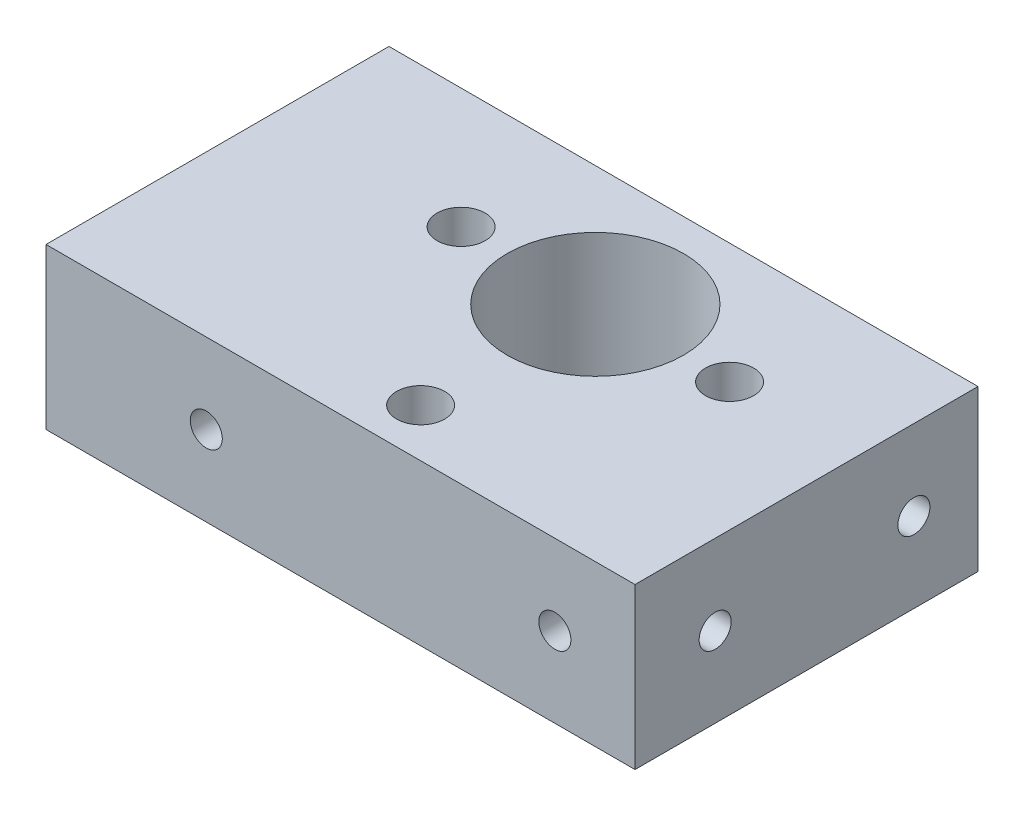
ISO-10303-21;
HEADER;
FILE_DESCRIPTION(('STEP AP214'),'2;1');
FILE_NAME('part.step','',(''),(''),'','','');
FILE_SCHEMA(('AUTOMOTIVE_DESIGN { 1 0 10303 214 1 1 1 1 }'));
ENDSEC;
DATA;
#1=APPLICATION_CONTEXT('core data for automotive mechanical design processes');
#2=APPLICATION_PROTOCOL_DEFINITION('international standard','automotive_design',2000,#1);
#3=PRODUCT_CONTEXT('',#1,'mechanical');
#4=PRODUCT('Part','Part','',(#3));
#5=PRODUCT_RELATED_PRODUCT_CATEGORY('part','',(#4));
#6=PRODUCT_DEFINITION_FORMATION('','',#4);
#7=PRODUCT_DEFINITION_CONTEXT('part definition',#1,'design');
#8=PRODUCT_DEFINITION('design','',#6,#7);
#9=PRODUCT_DEFINITION_SHAPE('','',#8);
#10=(LENGTH_UNIT() NAMED_UNIT(*) SI_UNIT(.MILLI.,.METRE.));
#11=(NAMED_UNIT(*) PLANE_ANGLE_UNIT() SI_UNIT($,.RADIAN.));
#12=(NAMED_UNIT(*) SI_UNIT($,.STERADIAN.) SOLID_ANGLE_UNIT());
#13=UNCERTAINTY_MEASURE_WITH_UNIT(LENGTH_MEASURE(1.E-05),#10,'distance_accuracy_value','');
#14=(GEOMETRIC_REPRESENTATION_CONTEXT(3) GLOBAL_UNCERTAINTY_ASSIGNED_CONTEXT((#13)) GLOBAL_UNIT_ASSIGNED_CONTEXT((#10,
#11,#12)) REPRESENTATION_CONTEXT('',''));
#15=CARTESIAN_POINT('',(0.,0.,0.));
#16=DIRECTION('',(0.,0.,1.));
#17=DIRECTION('',(1.,0.,0.));
#18=AXIS2_PLACEMENT_3D('',#15,#16,#17);
#19=CARTESIAN_POINT('',(0.,10.,13.9));
#20=DIRECTION('',(0.,0.,-1.));
#21=DIRECTION('',(-1.,0.,0.));
#22=AXIS2_PLACEMENT_3D('',#19,#20,#21);
#23=PLANE('',#22);
#24=CARTESIAN_POINT('',(11.375,5.,13.9));
#25=DIRECTION('',(0.,0.,-1.));
#26=DIRECTION('',(-1.,0.,0.));
#27=AXIS2_PLACEMENT_3D('',#24,#25,#26);
#28=CIRCLE('',#27,1.);
#29=CARTESIAN_POINT('',(10.375,5.,13.9));
#30=VERTEX_POINT('',#29);
#31=EDGE_CURVE('E176',#30,#30,#28,.T.);
#32=ORIENTED_EDGE('',*,*,#31,.T.);
#33=EDGE_LOOP('',(#32));
#34=FACE_BOUND('',#33,.T.);
#35=CARTESIAN_POINT('',(-10.375,5.,13.9));
#36=DIRECTION('',(0.,0.,-1.));
#37=DIRECTION('',(-1.,0.,0.));
#38=AXIS2_PLACEMENT_3D('',#35,#36,#37);
#39=CIRCLE('',#38,1.);
#40=CARTESIAN_POINT('',(-11.375,5.,13.9));
#41=VERTEX_POINT('',#40);
#42=EDGE_CURVE('E180',#41,#41,#39,.T.);
#43=ORIENTED_EDGE('',*,*,#42,.T.);
#44=EDGE_LOOP('',(#43));
#45=FACE_BOUND('',#44,.T.);
#46=DIRECTION('',(1.,0.,0.));
#47=VECTOR('',#46,1.);
#48=CARTESIAN_POINT('',(0.,0.,13.9));
#49=LINE('',#48,#47);
#50=CARTESIAN_POINT('',(-20.375,0.,13.9));
#51=VERTEX_POINT('',#50);
#52=CARTESIAN_POINT('',(16.375,0.,13.9));
#53=VERTEX_POINT('',#52);
#54=EDGE_CURVE('E117',#51,#53,#49,.T.);
#55=ORIENTED_EDGE('',*,*,#54,.T.);
#56=DIRECTION('',(0.,-1.,0.));
#57=VECTOR('',#56,1.);
#58=CARTESIAN_POINT('',(16.375,10.,13.9));
#59=LINE('',#58,#57);
#60=CARTESIAN_POINT('',(16.375,10.,13.9));
#61=VERTEX_POINT('',#60);
#62=EDGE_CURVE('E12',#61,#53,#59,.T.);
#63=ORIENTED_EDGE('',*,*,#62,.F.);
#64=DIRECTION('',(1.,0.,0.));
#65=VECTOR('',#64,1.);
#66=CARTESIAN_POINT('',(0.,10.,13.9));
#67=LINE('',#66,#65);
#68=CARTESIAN_POINT('',(-20.375,10.,13.9));
#69=VERTEX_POINT('',#68);
#70=EDGE_CURVE('E89',#69,#61,#67,.T.);
#71=ORIENTED_EDGE('',*,*,#70,.F.);
#72=DIRECTION('',(0.,-1.,0.));
#73=VECTOR('',#72,1.);
#74=CARTESIAN_POINT('',(-20.375,10.,13.9));
#75=LINE('',#74,#73);
#76=EDGE_CURVE('E116',#69,#51,#75,.T.);
#77=ORIENTED_EDGE('',*,*,#76,.T.);
#78=EDGE_LOOP('',(#55,#63,#71,#77));
#79=FACE_BOUND('',#78,.T.);
#80=ADVANCED_FACE('F39',(#34,#45,#79),#23,.F.);
#81=CARTESIAN_POINT('',(16.375,10.,0.));
#82=DIRECTION('',(-1.,0.,0.));
#83=DIRECTION('',(0.,0.,1.));
#84=AXIS2_PLACEMENT_3D('',#81,#82,#83);
#85=PLANE('',#84);
#86=CARTESIAN_POINT('',(16.375,5.,8.9));
#87=DIRECTION('',(1.,0.,0.));
#88=DIRECTION('',(0.,0.,-1.));
#89=AXIS2_PLACEMENT_3D('',#86,#87,#88);
#90=CIRCLE('',#89,1.);
#91=CARTESIAN_POINT('',(16.375,5.,7.9));
#92=VERTEX_POINT('',#91);
#93=EDGE_CURVE('E315',#92,#92,#90,.T.);
#94=ORIENTED_EDGE('',*,*,#93,.F.);
#95=EDGE_LOOP('',(#94));
#96=FACE_BOUND('',#95,.T.);
#97=CARTESIAN_POINT('',(16.375,5.,-3.5));
#98=DIRECTION('',(1.,0.,0.));
#99=DIRECTION('',(0.,0.,-1.));
#100=AXIS2_PLACEMENT_3D('',#97,#98,#99);
#101=CIRCLE('',#100,1.);
#102=CARTESIAN_POINT('',(16.375,5.,-4.5));
#103=VERTEX_POINT('',#102);
#104=EDGE_CURVE('E320',#103,#103,#101,.T.);
#105=ORIENTED_EDGE('',*,*,#104,.F.);
#106=EDGE_LOOP('',(#105));
#107=FACE_BOUND('',#106,.T.);
#108=DIRECTION('',(0.,0.,-1.));
#109=VECTOR('',#108,1.);
#110=CARTESIAN_POINT('',(16.375,0.,0.));
#111=LINE('',#110,#109);
#112=CARTESIAN_POINT('',(16.375,0.,-7.5));
#113=VERTEX_POINT('',#112);
#114=EDGE_CURVE('E94',#53,#113,#111,.T.);
#115=ORIENTED_EDGE('',*,*,#114,.T.);
#116=DIRECTION('',(0.,-1.,0.));
#117=VECTOR('',#116,1.);
#118=CARTESIAN_POINT('',(16.375,10.,-7.5));
#119=LINE('',#118,#117);
#120=CARTESIAN_POINT('',(16.375,10.,-7.5));
#121=VERTEX_POINT('',#120);
#122=EDGE_CURVE('E48',#121,#113,#119,.T.);
#123=ORIENTED_EDGE('',*,*,#122,.F.);
#124=DIRECTION('',(0.,0.,-1.));
#125=VECTOR('',#124,1.);
#126=CARTESIAN_POINT('',(16.375,10.,0.));
#127=LINE('',#126,#125);
#128=EDGE_CURVE('E83',#61,#121,#127,.T.);
#129=ORIENTED_EDGE('',*,*,#128,.F.);
#130=ORIENTED_EDGE('',*,*,#62,.T.);
#131=EDGE_LOOP('',(#115,#123,#129,#130));
#132=FACE_BOUND('',#131,.T.);
#133=ADVANCED_FACE('F93',(#96,#107,#132),#85,.F.);
#134=CARTESIAN_POINT('',(0.,10.,-7.5));
#135=DIRECTION('',(0.,0.,-1.));
#136=DIRECTION('',(-1.,0.,0.));
#137=AXIS2_PLACEMENT_3D('',#134,#135,#136);
#138=PLANE('',#137);
#139=CARTESIAN_POINT('',(11.375,5.,-7.5));
#140=DIRECTION('',(0.,0.,-1.));
#141=DIRECTION('',(-1.,0.,0.));
#142=AXIS2_PLACEMENT_3D('',#139,#140,#141);
#143=CIRCLE('',#142,1.);
#144=CARTESIAN_POINT('',(10.375,5.,-7.5));
#145=VERTEX_POINT('',#144);
#146=EDGE_CURVE('E205',#145,#145,#143,.T.);
#147=ORIENTED_EDGE('',*,*,#146,.F.);
#148=EDGE_LOOP('',(#147));
#149=FACE_BOUND('',#148,.T.);
#150=CARTESIAN_POINT('',(-10.375,5.,-7.5));
#151=DIRECTION('',(0.,0.,-1.));
#152=DIRECTION('',(-1.,0.,0.));
#153=AXIS2_PLACEMENT_3D('',#150,#151,#152);
#154=CIRCLE('',#153,1.);
#155=CARTESIAN_POINT('',(-11.375,5.,-7.5));
#156=VERTEX_POINT('',#155);
#157=EDGE_CURVE('E208',#156,#156,#154,.T.);
#158=ORIENTED_EDGE('',*,*,#157,.F.);
#159=EDGE_LOOP('',(#158));
#160=FACE_BOUND('',#159,.T.);
#161=DIRECTION('',(1.,0.,0.));
#162=VECTOR('',#161,1.);
#163=CARTESIAN_POINT('',(0.,0.,-7.5));
#164=LINE('',#163,#162);
#165=CARTESIAN_POINT('',(-20.375,0.,-7.5));
#166=VERTEX_POINT('',#165);
#167=EDGE_CURVE('E121',#166,#113,#164,.T.);
#168=ORIENTED_EDGE('',*,*,#167,.F.);
#169=DIRECTION('',(0.,-1.,0.));
#170=VECTOR('',#169,1.);
#171=CARTESIAN_POINT('',(-20.375,10.,-7.5));
#172=LINE('',#171,#170);
#173=CARTESIAN_POINT('',(-20.375,10.,-7.5));
#174=VERTEX_POINT('',#173);
#175=EDGE_CURVE('E73',#174,#166,#172,.T.);
#176=ORIENTED_EDGE('',*,*,#175,.F.);
#177=DIRECTION('',(1.,0.,0.));
#178=VECTOR('',#177,1.);
#179=CARTESIAN_POINT('',(0.,10.,-7.5));
#180=LINE('',#179,#178);
#181=EDGE_CURVE('E87',#174,#121,#180,.T.);
#182=ORIENTED_EDGE('',*,*,#181,.T.);
#183=ORIENTED_EDGE('',*,*,#122,.T.);
#184=EDGE_LOOP('',(#168,#176,#182,#183));
#185=FACE_BOUND('',#184,.T.);
#186=ADVANCED_FACE('F99',(#149,#160,#185),#138,.T.);
#187=CARTESIAN_POINT('',(8.375,10.,0.));
#188=DIRECTION('',(0.,-1.,0.));
#189=DIRECTION('',(0.,0.,-1.));
#190=AXIS2_PLACEMENT_3D('',#187,#188,#189);
#191=CYLINDRICAL_SURFACE('',#190,1.5);
#192=CARTESIAN_POINT('',(8.375,7.,0.));
#193=DIRECTION('',(0.,1.,0.));
#194=DIRECTION('',(0.,0.,1.));
#195=AXIS2_PLACEMENT_3D('',#192,#193,#194);
#196=CIRCLE('',#195,1.5);
#197=CARTESIAN_POINT('',(8.375,7.,1.5));
#198=VERTEX_POINT('',#197);
#199=EDGE_CURVE('E42',#198,#198,#196,.T.);
#200=ORIENTED_EDGE('',*,*,#199,.F.);
#201=EDGE_LOOP('',(#200));
#202=FACE_BOUND('',#201,.T.);
#203=CARTESIAN_POINT('',(8.375,10.,0.));
#204=DIRECTION('',(0.,1.,0.));
#205=DIRECTION('',(0.,0.,1.));
#206=AXIS2_PLACEMENT_3D('',#203,#204,#205);
#207=CIRCLE('',#206,1.5);
#208=CARTESIAN_POINT('',(8.375,10.,1.5));
#209=VERTEX_POINT('',#208);
#210=EDGE_CURVE('E110',#209,#209,#207,.T.);
#211=ORIENTED_EDGE('',*,*,#210,.T.);
#212=EDGE_LOOP('',(#211));
#213=FACE_BOUND('',#212,.T.);
#214=ADVANCED_FACE('F142',(#202,#213),#191,.F.);
#215=CARTESIAN_POINT('',(-8.375,10.,0.));
#216=DIRECTION('',(0.,-1.,0.));
#217=DIRECTION('',(0.,0.,-1.));
#218=AXIS2_PLACEMENT_3D('',#215,#216,#217);
#219=CYLINDRICAL_SURFACE('',#218,1.5);
#220=CARTESIAN_POINT('',(-8.375,7.,0.));
#221=DIRECTION('',(0.,1.,0.));
#222=DIRECTION('',(0.,0.,1.));
#223=AXIS2_PLACEMENT_3D('',#220,#221,#222);
#224=CIRCLE('',#223,1.5);
#225=CARTESIAN_POINT('',(-8.375,7.,1.5));
#226=VERTEX_POINT('',#225);
#227=EDGE_CURVE('E131',#226,#226,#224,.T.);
#228=ORIENTED_EDGE('',*,*,#227,.F.);
#229=EDGE_LOOP('',(#228));
#230=FACE_BOUND('',#229,.T.);
#231=CARTESIAN_POINT('',(-8.375,10.,0.));
#232=DIRECTION('',(0.,1.,0.));
#233=DIRECTION('',(0.,0.,1.));
#234=AXIS2_PLACEMENT_3D('',#231,#232,#233);
#235=CIRCLE('',#234,1.5);
#236=CARTESIAN_POINT('',(-8.375,10.,1.5));
#237=VERTEX_POINT('',#236);
#238=EDGE_CURVE('E107',#237,#237,#235,.T.);
#239=ORIENTED_EDGE('',*,*,#238,.T.);
#240=EDGE_LOOP('',(#239));
#241=FACE_BOUND('',#240,.T.);
#242=ADVANCED_FACE('F145',(#230,#241),#219,.F.);
#243=CARTESIAN_POINT('',(0.,10.,0.));
#244=DIRECTION('',(0.,-1.,0.));
#245=DIRECTION('',(0.,0.,-1.));
#246=AXIS2_PLACEMENT_3D('',#243,#244,#245);
#247=CYLINDRICAL_SURFACE('',#246,5.5);
#248=CARTESIAN_POINT('',(0.,10.,0.));
#249=DIRECTION('',(0.,1.,0.));
#250=DIRECTION('',(0.,0.,1.));
#251=AXIS2_PLACEMENT_3D('',#248,#249,#250);
#252=CIRCLE('',#251,5.5);
#253=CARTESIAN_POINT('',(0.,10.,5.5));
#254=VERTEX_POINT('',#253);
#255=EDGE_CURVE('E101',#254,#254,#252,.T.);
#256=ORIENTED_EDGE('',*,*,#255,.T.);
#257=EDGE_LOOP('',(#256));
#258=FACE_BOUND('',#257,.T.);
#259=CARTESIAN_POINT('',(0.,0.,0.));
#260=DIRECTION('',(0.,1.,0.));
#261=DIRECTION('',(0.,0.,1.));
#262=AXIS2_PLACEMENT_3D('',#259,#260,#261);
#263=CIRCLE('',#262,5.5);
#264=CARTESIAN_POINT('',(0.,0.,5.5));
#265=VERTEX_POINT('',#264);
#266=EDGE_CURVE('E124',#265,#265,#263,.T.);
#267=ORIENTED_EDGE('',*,*,#266,.F.);
#268=EDGE_LOOP('',(#267));
#269=FACE_BOUND('',#268,.T.);
#270=ADVANCED_FACE('F163',(#258,#269),#247,.F.);
#271=CARTESIAN_POINT('',(-20.375,10.,0.));
#272=DIRECTION('',(1.,0.,0.));
#273=DIRECTION('',(0.,0.,-1.));
#274=AXIS2_PLACEMENT_3D('',#271,#272,#273);
#275=PLANE('',#274);
#276=DIRECTION('',(0.,0.,1.));
#277=VECTOR('',#276,1.);
#278=CARTESIAN_POINT('',(-20.375,0.,0.));
#279=LINE('',#278,#277);
#280=EDGE_CURVE('E76',#166,#51,#279,.T.);
#281=ORIENTED_EDGE('',*,*,#280,.T.);
#282=ORIENTED_EDGE('',*,*,#76,.F.);
#283=DIRECTION('',(0.,0.,1.));
#284=VECTOR('',#283,1.);
#285=CARTESIAN_POINT('',(-20.375,10.,0.));
#286=LINE('',#285,#284);
#287=EDGE_CURVE('E57',#174,#69,#286,.T.);
#288=ORIENTED_EDGE('',*,*,#287,.F.);
#289=ORIENTED_EDGE('',*,*,#175,.T.);
#290=EDGE_LOOP('',(#281,#282,#288,#289));
#291=FACE_BOUND('',#290,.T.);
#292=ADVANCED_FACE('F157',(#291),#275,.F.);
#293=CARTESIAN_POINT('',(0.,10.,10.9));
#294=DIRECTION('',(0.,-1.,0.));
#295=DIRECTION('',(0.,0.,-1.));
#296=AXIS2_PLACEMENT_3D('',#293,#294,#295);
#297=CYLINDRICAL_SURFACE('',#296,1.5);
#298=CARTESIAN_POINT('',(0.,7.,10.9));
#299=DIRECTION('',(0.,1.,0.));
#300=DIRECTION('',(0.,0.,1.));
#301=AXIS2_PLACEMENT_3D('',#298,#299,#300);
#302=CIRCLE('',#301,1.5);
#303=CARTESIAN_POINT('',(0.,7.,12.4));
#304=VERTEX_POINT('',#303);
#305=EDGE_CURVE('E129',#304,#304,#302,.T.);
#306=ORIENTED_EDGE('',*,*,#305,.F.);
#307=EDGE_LOOP('',(#306));
#308=FACE_BOUND('',#307,.T.);
#309=CARTESIAN_POINT('',(0.,10.,10.9));
#310=DIRECTION('',(0.,1.,0.));
#311=DIRECTION('',(0.,0.,1.));
#312=AXIS2_PLACEMENT_3D('',#309,#310,#311);
#313=CIRCLE('',#312,1.5);
#314=CARTESIAN_POINT('',(0.,10.,12.4));
#315=VERTEX_POINT('',#314);
#316=EDGE_CURVE('E113',#315,#315,#313,.T.);
#317=ORIENTED_EDGE('',*,*,#316,.T.);
#318=EDGE_LOOP('',(#317));
#319=FACE_BOUND('',#318,.T.);
#320=ADVANCED_FACE('F152',(#308,#319),#297,.F.);
#321=CARTESIAN_POINT('',(0.,10.,0.));
#322=DIRECTION('',(0.,1.,0.));
#323=DIRECTION('',(0.,0.,1.));
#324=AXIS2_PLACEMENT_3D('',#321,#322,#323);
#325=PLANE('',#324);
#326=ORIENTED_EDGE('',*,*,#70,.T.);
#327=ORIENTED_EDGE('',*,*,#128,.T.);
#328=ORIENTED_EDGE('',*,*,#181,.F.);
#329=ORIENTED_EDGE('',*,*,#287,.T.);
#330=EDGE_LOOP('',(#326,#327,#328,#329));
#331=FACE_BOUND('',#330,.T.);
#332=ORIENTED_EDGE('',*,*,#255,.F.);
#333=EDGE_LOOP('',(#332));
#334=FACE_BOUND('',#333,.T.);
#335=ORIENTED_EDGE('',*,*,#238,.F.);
#336=EDGE_LOOP('',(#335));
#337=FACE_BOUND('',#336,.T.);
#338=ORIENTED_EDGE('',*,*,#210,.F.);
#339=EDGE_LOOP('',(#338));
#340=FACE_BOUND('',#339,.T.);
#341=ORIENTED_EDGE('',*,*,#316,.F.);
#342=EDGE_LOOP('',(#341));
#343=FACE_BOUND('',#342,.T.);
#344=ADVANCED_FACE('F84',(#331,#334,#337,#340,#343),#325,.T.);
#345=CARTESIAN_POINT('',(0.,0.,0.));
#346=DIRECTION('',(0.,1.,0.));
#347=DIRECTION('',(0.,0.,1.));
#348=AXIS2_PLACEMENT_3D('',#345,#346,#347);
#349=PLANE('',#348);
#350=CARTESIAN_POINT('',(-8.375,0.,0.));
#351=DIRECTION('',(0.,1.,0.));
#352=DIRECTION('',(0.,0.,1.));
#353=AXIS2_PLACEMENT_3D('',#350,#351,#352);
#354=CIRCLE('',#353,2.25);
#355=CARTESIAN_POINT('',(-8.375,0.,2.25));
#356=VERTEX_POINT('',#355);
#357=EDGE_CURVE('E219',#356,#356,#354,.T.);
#358=ORIENTED_EDGE('',*,*,#357,.T.);
#359=EDGE_LOOP('',(#358));
#360=FACE_BOUND('',#359,.T.);
#361=CARTESIAN_POINT('',(0.,0.,10.9));
#362=DIRECTION('',(0.,1.,0.));
#363=DIRECTION('',(0.,0.,1.));
#364=AXIS2_PLACEMENT_3D('',#361,#362,#363);
#365=CIRCLE('',#364,2.25);
#366=CARTESIAN_POINT('',(0.,0.,13.15));
#367=VERTEX_POINT('',#366);
#368=EDGE_CURVE('E222',#367,#367,#365,.T.);
#369=ORIENTED_EDGE('',*,*,#368,.T.);
#370=EDGE_LOOP('',(#369));
#371=FACE_BOUND('',#370,.T.);
#372=CARTESIAN_POINT('',(8.375,0.,0.));
#373=DIRECTION('',(0.,1.,0.));
#374=DIRECTION('',(0.,0.,1.));
#375=AXIS2_PLACEMENT_3D('',#372,#373,#374);
#376=CIRCLE('',#375,2.25);
#377=CARTESIAN_POINT('',(8.375,0.,2.25));
#378=VERTEX_POINT('',#377);
#379=EDGE_CURVE('E228',#378,#378,#376,.T.);
#380=ORIENTED_EDGE('',*,*,#379,.T.);
#381=EDGE_LOOP('',(#380));
#382=FACE_BOUND('',#381,.T.);
#383=ORIENTED_EDGE('',*,*,#54,.F.);
#384=ORIENTED_EDGE('',*,*,#280,.F.);
#385=ORIENTED_EDGE('',*,*,#167,.T.);
#386=ORIENTED_EDGE('',*,*,#114,.F.);
#387=EDGE_LOOP('',(#383,#384,#385,#386));
#388=FACE_BOUND('',#387,.T.);
#389=ORIENTED_EDGE('',*,*,#266,.T.);
#390=EDGE_LOOP('',(#389));
#391=FACE_BOUND('',#390,.T.);
#392=ADVANCED_FACE('F151',(#360,#371,#382,#388,#391),#349,.F.);
#393=CARTESIAN_POINT('',(8.375,16.3639610306789,0.));
#394=DIRECTION('',(0.,-1.,0.));
#395=DIRECTION('',(0.,0.,-1.));
#396=AXIS2_PLACEMENT_3D('',#393,#394,#395);
#397=CYLINDRICAL_SURFACE('',#396,2.25);
#398=ORIENTED_EDGE('',*,*,#379,.F.);
#399=EDGE_LOOP('',(#398));
#400=FACE_BOUND('',#399,.T.);
#401=CARTESIAN_POINT('',(8.375,7.,0.));
#402=DIRECTION('',(0.,1.,0.));
#403=DIRECTION('',(0.,0.,1.));
#404=AXIS2_PLACEMENT_3D('',#401,#402,#403);
#405=CIRCLE('',#404,2.25);
#406=CARTESIAN_POINT('',(8.375,7.,2.25));
#407=VERTEX_POINT('',#406);
#408=EDGE_CURVE('E231',#407,#407,#405,.T.);
#409=ORIENTED_EDGE('',*,*,#408,.T.);
#410=EDGE_LOOP('',(#409));
#411=FACE_BOUND('',#410,.T.);
#412=ADVANCED_FACE('F185',(#400,#411),#397,.F.);
#413=CARTESIAN_POINT('',(0.,7.,0.));
#414=DIRECTION('',(0.,1.,0.));
#415=DIRECTION('',(0.,0.,1.));
#416=AXIS2_PLACEMENT_3D('',#413,#414,#415);
#417=PLANE('',#416);
#418=ORIENTED_EDGE('',*,*,#199,.T.);
#419=EDGE_LOOP('',(#418));
#420=FACE_BOUND('',#419,.T.);
#421=ORIENTED_EDGE('',*,*,#408,.F.);
#422=EDGE_LOOP('',(#421));
#423=FACE_BOUND('',#422,.T.);
#424=ADVANCED_FACE('F139',(#420,#423),#417,.F.);
#425=CARTESIAN_POINT('',(0.,16.3639610306789,10.9));
#426=DIRECTION('',(0.,-1.,0.));
#427=DIRECTION('',(0.,0.,-1.));
#428=AXIS2_PLACEMENT_3D('',#425,#426,#427);
#429=CYLINDRICAL_SURFACE('',#428,2.25);
#430=ORIENTED_EDGE('',*,*,#368,.F.);
#431=EDGE_LOOP('',(#430));
#432=FACE_BOUND('',#431,.T.);
#433=CARTESIAN_POINT('',(0.,7.,10.9));
#434=DIRECTION('',(0.,1.,0.));
#435=DIRECTION('',(0.,0.,1.));
#436=AXIS2_PLACEMENT_3D('',#433,#434,#435);
#437=CIRCLE('',#436,2.25);
#438=CARTESIAN_POINT('',(0.,7.,13.15));
#439=VERTEX_POINT('',#438);
#440=EDGE_CURVE('E225',#439,#439,#437,.T.);
#441=ORIENTED_EDGE('',*,*,#440,.T.);
#442=EDGE_LOOP('',(#441));
#443=FACE_BOUND('',#442,.T.);
#444=ADVANCED_FACE('F244',(#432,#443),#429,.F.);
#445=CARTESIAN_POINT('',(0.,7.,0.));
#446=DIRECTION('',(0.,1.,0.));
#447=DIRECTION('',(0.,0.,1.));
#448=AXIS2_PLACEMENT_3D('',#445,#446,#447);
#449=PLANE('',#448);
#450=ORIENTED_EDGE('',*,*,#305,.T.);
#451=EDGE_LOOP('',(#450));
#452=FACE_BOUND('',#451,.T.);
#453=ORIENTED_EDGE('',*,*,#440,.F.);
#454=EDGE_LOOP('',(#453));
#455=FACE_BOUND('',#454,.T.);
#456=ADVANCED_FACE('F249',(#452,#455),#449,.F.);
#457=CARTESIAN_POINT('',(-8.375,16.3639610306789,0.));
#458=DIRECTION('',(0.,-1.,0.));
#459=DIRECTION('',(0.,0.,-1.));
#460=AXIS2_PLACEMENT_3D('',#457,#458,#459);
#461=CYLINDRICAL_SURFACE('',#460,2.25);
#462=ORIENTED_EDGE('',*,*,#357,.F.);
#463=EDGE_LOOP('',(#462));
#464=FACE_BOUND('',#463,.T.);
#465=CARTESIAN_POINT('',(-8.375,7.,0.));
#466=DIRECTION('',(0.,1.,0.));
#467=DIRECTION('',(0.,0.,1.));
#468=AXIS2_PLACEMENT_3D('',#465,#466,#467);
#469=CIRCLE('',#468,2.25);
#470=CARTESIAN_POINT('',(-8.375,7.,2.25));
#471=VERTEX_POINT('',#470);
#472=EDGE_CURVE('E132',#471,#471,#469,.T.);
#473=ORIENTED_EDGE('',*,*,#472,.T.);
#474=EDGE_LOOP('',(#473));
#475=FACE_BOUND('',#474,.T.);
#476=ADVANCED_FACE('F255',(#464,#475),#461,.F.);
#477=CARTESIAN_POINT('',(0.,7.,0.));
#478=DIRECTION('',(0.,1.,0.));
#479=DIRECTION('',(0.,0.,1.));
#480=AXIS2_PLACEMENT_3D('',#477,#478,#479);
#481=PLANE('',#480);
#482=ORIENTED_EDGE('',*,*,#227,.T.);
#483=EDGE_LOOP('',(#482));
#484=FACE_BOUND('',#483,.T.);
#485=ORIENTED_EDGE('',*,*,#472,.F.);
#486=EDGE_LOOP('',(#485));
#487=FACE_BOUND('',#486,.T.);
#488=ADVANCED_FACE('F257',(#484,#487),#481,.F.);
#489=CARTESIAN_POINT('',(-10.375,5.,-5.5));
#490=DIRECTION('',(0.,0.,-1.));
#491=DIRECTION('',(-1.,0.,0.));
#492=AXIS2_PLACEMENT_3D('',#489,#490,#491);
#493=CYLINDRICAL_SURFACE('',#492,1.);
#494=CARTESIAN_POINT('',(-10.375,5.,-5.5));
#495=DIRECTION('',(0.,0.,-1.));
#496=DIRECTION('',(-1.,0.,0.));
#497=AXIS2_PLACEMENT_3D('',#494,#495,#496);
#498=CIRCLE('',#497,1.);
#499=CARTESIAN_POINT('',(-11.375,5.,-5.5));
#500=VERTEX_POINT('',#499);
#501=EDGE_CURVE('E210',#500,#500,#498,.T.);
#502=ORIENTED_EDGE('',*,*,#501,.F.);
#503=EDGE_LOOP('',(#502));
#504=FACE_BOUND('',#503,.T.);
#505=ORIENTED_EDGE('',*,*,#157,.T.);
#506=EDGE_LOOP('',(#505));
#507=FACE_BOUND('',#506,.T.);
#508=ADVANCED_FACE('F260',(#504,#507),#493,.F.);
#509=CARTESIAN_POINT('',(-10.375,5.,-5.5));
#510=DIRECTION('',(0.,0.,-1.));
#511=DIRECTION('',(-1.,0.,0.));
#512=AXIS2_PLACEMENT_3D('',#509,#510,#511);
#513=PLANE('',#512);
#514=ORIENTED_EDGE('',*,*,#501,.T.);
#515=EDGE_LOOP('',(#514));
#516=FACE_BOUND('',#515,.T.);
#517=ADVANCED_FACE('F266',(#516),#513,.T.);
#518=CARTESIAN_POINT('',(11.375,5.,-5.5));
#519=DIRECTION('',(0.,0.,-1.));
#520=DIRECTION('',(-1.,0.,0.));
#521=AXIS2_PLACEMENT_3D('',#518,#519,#520);
#522=CYLINDRICAL_SURFACE('',#521,1.);
#523=CARTESIAN_POINT('',(11.375,5.,-5.5));
#524=DIRECTION('',(0.,0.,-1.));
#525=DIRECTION('',(-1.,0.,0.));
#526=AXIS2_PLACEMENT_3D('',#523,#524,#525);
#527=CIRCLE('',#526,1.);
#528=CARTESIAN_POINT('',(10.375,5.,-5.5));
#529=VERTEX_POINT('',#528);
#530=EDGE_CURVE('E234',#529,#529,#527,.T.);
#531=ORIENTED_EDGE('',*,*,#530,.F.);
#532=EDGE_LOOP('',(#531));
#533=FACE_BOUND('',#532,.T.);
#534=ORIENTED_EDGE('',*,*,#146,.T.);
#535=EDGE_LOOP('',(#534));
#536=FACE_BOUND('',#535,.T.);
#537=ADVANCED_FACE('F270',(#533,#536),#522,.F.);
#538=CARTESIAN_POINT('',(11.375,5.,-5.5));
#539=DIRECTION('',(0.,0.,-1.));
#540=DIRECTION('',(-1.,0.,0.));
#541=AXIS2_PLACEMENT_3D('',#538,#539,#540);
#542=PLANE('',#541);
#543=ORIENTED_EDGE('',*,*,#530,.T.);
#544=EDGE_LOOP('',(#543));
#545=FACE_BOUND('',#544,.T.);
#546=ADVANCED_FACE('F274',(#545),#542,.T.);
#547=CARTESIAN_POINT('',(-10.375,5.,11.9));
#548=DIRECTION('',(0.,0.,1.));
#549=DIRECTION('',(1.,0.,0.));
#550=AXIS2_PLACEMENT_3D('',#547,#548,#549);
#551=CYLINDRICAL_SURFACE('',#550,1.);
#552=CARTESIAN_POINT('',(-10.375,5.,11.9));
#553=DIRECTION('',(0.,0.,-1.));
#554=DIRECTION('',(-1.,0.,0.));
#555=AXIS2_PLACEMENT_3D('',#552,#553,#554);
#556=CIRCLE('',#555,1.);
#557=CARTESIAN_POINT('',(-11.375,5.,11.9));
#558=VERTEX_POINT('',#557);
#559=EDGE_CURVE('E317',#558,#558,#556,.T.);
#560=ORIENTED_EDGE('',*,*,#559,.T.);
#561=EDGE_LOOP('',(#560));
#562=FACE_BOUND('',#561,.T.);
#563=ORIENTED_EDGE('',*,*,#42,.F.);
#564=EDGE_LOOP('',(#563));
#565=FACE_BOUND('',#564,.T.);
#566=ADVANCED_FACE('F278',(#562,#565),#551,.F.);
#567=CARTESIAN_POINT('',(-10.375,5.,11.9));
#568=DIRECTION('',(0.,0.,-1.));
#569=DIRECTION('',(-1.,0.,0.));
#570=AXIS2_PLACEMENT_3D('',#567,#568,#569);
#571=PLANE('',#570);
#572=ORIENTED_EDGE('',*,*,#559,.F.);
#573=EDGE_LOOP('',(#572));
#574=FACE_BOUND('',#573,.T.);
#575=ADVANCED_FACE('F282',(#574),#571,.F.);
#576=CARTESIAN_POINT('',(11.375,5.,11.9));
#577=DIRECTION('',(0.,0.,1.));
#578=DIRECTION('',(1.,0.,0.));
#579=AXIS2_PLACEMENT_3D('',#576,#577,#578);
#580=CYLINDRICAL_SURFACE('',#579,1.);
#581=CARTESIAN_POINT('',(11.375,5.,11.9));
#582=DIRECTION('',(0.,0.,-1.));
#583=DIRECTION('',(-1.,0.,0.));
#584=AXIS2_PLACEMENT_3D('',#581,#582,#583);
#585=CIRCLE('',#584,1.);
#586=CARTESIAN_POINT('',(10.375,5.,11.9));
#587=VERTEX_POINT('',#586);
#588=EDGE_CURVE('E211',#587,#587,#585,.T.);
#589=ORIENTED_EDGE('',*,*,#588,.T.);
#590=EDGE_LOOP('',(#589));
#591=FACE_BOUND('',#590,.T.);
#592=ORIENTED_EDGE('',*,*,#31,.F.);
#593=EDGE_LOOP('',(#592));
#594=FACE_BOUND('',#593,.T.);
#595=ADVANCED_FACE('F286',(#591,#594),#580,.F.);
#596=CARTESIAN_POINT('',(11.375,5.,11.9));
#597=DIRECTION('',(0.,0.,-1.));
#598=DIRECTION('',(-1.,0.,0.));
#599=AXIS2_PLACEMENT_3D('',#596,#597,#598);
#600=PLANE('',#599);
#601=ORIENTED_EDGE('',*,*,#588,.F.);
#602=EDGE_LOOP('',(#601));
#603=FACE_BOUND('',#602,.T.);
#604=ADVANCED_FACE('F290',(#603),#600,.F.);
#605=CARTESIAN_POINT('',(12.375,5.,-3.5));
#606=DIRECTION('',(1.,0.,0.));
#607=DIRECTION('',(0.,0.,-1.));
#608=AXIS2_PLACEMENT_3D('',#605,#606,#607);
#609=CYLINDRICAL_SURFACE('',#608,1.);
#610=CARTESIAN_POINT('',(12.375,5.,-3.5));
#611=DIRECTION('',(1.,0.,0.));
#612=DIRECTION('',(0.,0.,-1.));
#613=AXIS2_PLACEMENT_3D('',#610,#611,#612);
#614=CIRCLE('',#613,1.);
#615=CARTESIAN_POINT('',(12.375,5.,-4.5));
#616=VERTEX_POINT('',#615);
#617=EDGE_CURVE('E325',#616,#616,#614,.T.);
#618=ORIENTED_EDGE('',*,*,#617,.F.);
#619=EDGE_LOOP('',(#618));
#620=FACE_BOUND('',#619,.T.);
#621=ORIENTED_EDGE('',*,*,#104,.T.);
#622=EDGE_LOOP('',(#621));
#623=FACE_BOUND('',#622,.T.);
#624=ADVANCED_FACE('F294',(#620,#623),#609,.F.);
#625=CARTESIAN_POINT('',(12.375,5.,-3.5));
#626=DIRECTION('',(1.,0.,0.));
#627=DIRECTION('',(0.,0.,-1.));
#628=AXIS2_PLACEMENT_3D('',#625,#626,#627);
#629=PLANE('',#628);
#630=ORIENTED_EDGE('',*,*,#617,.T.);
#631=EDGE_LOOP('',(#630));
#632=FACE_BOUND('',#631,.T.);
#633=ADVANCED_FACE('F296',(#632),#629,.T.);
#634=CARTESIAN_POINT('',(12.375,5.,8.9));
#635=DIRECTION('',(1.,0.,0.));
#636=DIRECTION('',(0.,0.,-1.));
#637=AXIS2_PLACEMENT_3D('',#634,#635,#636);
#638=CYLINDRICAL_SURFACE('',#637,1.);
#639=CARTESIAN_POINT('',(12.375,5.,8.9));
#640=DIRECTION('',(1.,0.,0.));
#641=DIRECTION('',(0.,0.,-1.));
#642=AXIS2_PLACEMENT_3D('',#639,#640,#641);
#643=CIRCLE('',#642,1.);
#644=CARTESIAN_POINT('',(12.375,5.,7.9));
#645=VERTEX_POINT('',#644);
#646=EDGE_CURVE('E314',#645,#645,#643,.T.);
#647=ORIENTED_EDGE('',*,*,#646,.F.);
#648=EDGE_LOOP('',(#647));
#649=FACE_BOUND('',#648,.T.);
#650=ORIENTED_EDGE('',*,*,#93,.T.);
#651=EDGE_LOOP('',(#650));
#652=FACE_BOUND('',#651,.T.);
#653=ADVANCED_FACE('F299',(#649,#652),#638,.F.);
#654=CARTESIAN_POINT('',(12.375,5.,8.9));
#655=DIRECTION('',(1.,0.,0.));
#656=DIRECTION('',(0.,0.,-1.));
#657=AXIS2_PLACEMENT_3D('',#654,#655,#656);
#658=PLANE('',#657);
#659=ORIENTED_EDGE('',*,*,#646,.T.);
#660=EDGE_LOOP('',(#659));
#661=FACE_BOUND('',#660,.T.);
#662=ADVANCED_FACE('F306',(#661),#658,.T.);
#663=CLOSED_SHELL('',(#80,#133,#186,#214,#242,#270,#292,#320,#344,#392,#412,#424,#444,#456,#476,
#488,#508,#517,#537,#546,#566,#575,#595,#604,#624,#633,#653,#662));
#664=MANIFOLD_SOLID_BREP('B2',#663);
#665=ADVANCED_BREP_SHAPE_REPRESENTATION('',(#18,#664),#14);
#666=SHAPE_DEFINITION_REPRESENTATION(#9,#665);
ENDSEC;
END-ISO-10303-21;
